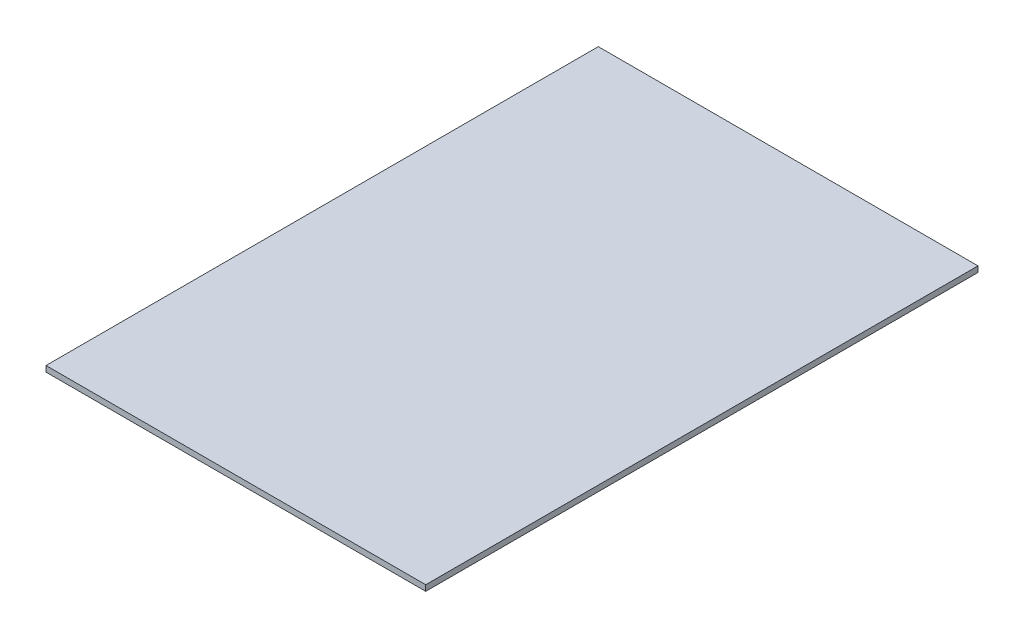
ISO-10303-21;
HEADER;
FILE_DESCRIPTION(('STEP AP214'),'2;1');
FILE_NAME('part.step','',(''),(''),'','','');
FILE_SCHEMA(('AUTOMOTIVE_DESIGN { 1 0 10303 214 1 1 1 1 }'));
ENDSEC;
DATA;
#1=APPLICATION_CONTEXT('core data for automotive mechanical design processes');
#2=APPLICATION_PROTOCOL_DEFINITION('international standard','automotive_design',2000,#1);
#3=PRODUCT_CONTEXT('',#1,'mechanical');
#4=PRODUCT('Part','Part','',(#3));
#5=PRODUCT_RELATED_PRODUCT_CATEGORY('part','',(#4));
#6=PRODUCT_DEFINITION_FORMATION('','',#4);
#7=PRODUCT_DEFINITION_CONTEXT('part definition',#1,'design');
#8=PRODUCT_DEFINITION('design','',#6,#7);
#9=PRODUCT_DEFINITION_SHAPE('','',#8);
#10=(LENGTH_UNIT() NAMED_UNIT(*) SI_UNIT(.MILLI.,.METRE.));
#11=(NAMED_UNIT(*) PLANE_ANGLE_UNIT() SI_UNIT($,.RADIAN.));
#12=(NAMED_UNIT(*) SI_UNIT($,.STERADIAN.) SOLID_ANGLE_UNIT());
#13=UNCERTAINTY_MEASURE_WITH_UNIT(LENGTH_MEASURE(1.E-05),#10,'distance_accuracy_value','');
#14=(GEOMETRIC_REPRESENTATION_CONTEXT(3) GLOBAL_UNCERTAINTY_ASSIGNED_CONTEXT((#13)) GLOBAL_UNIT_ASSIGNED_CONTEXT((#10,
#11,#12)) REPRESENTATION_CONTEXT('',''));
#15=CARTESIAN_POINT('',(0.,0.,0.));
#16=DIRECTION('',(0.,0.,1.));
#17=DIRECTION('',(1.,0.,0.));
#18=AXIS2_PLACEMENT_3D('',#15,#16,#17);
#19=CARTESIAN_POINT('',(419.1,12.7,-609.6));
#20=DIRECTION('',(1.,0.,0.));
#21=DIRECTION('',(0.,0.,-1.));
#22=AXIS2_PLACEMENT_3D('',#19,#20,#21);
#23=PLANE('',#22);
#24=DIRECTION('',(0.,0.,1.));
#25=VECTOR('',#24,1.);
#26=CARTESIAN_POINT('',(419.1,0.,-609.6));
#27=LINE('',#26,#25);
#28=CARTESIAN_POINT('',(419.1,0.,-609.6));
#29=VERTEX_POINT('',#28);
#30=CARTESIAN_POINT('',(419.1,0.,609.6));
#31=VERTEX_POINT('',#30);
#32=EDGE_CURVE('E98',#29,#31,#27,.T.);
#33=ORIENTED_EDGE('',*,*,#32,.F.);
#34=DIRECTION('',(0.,-1.,0.));
#35=VECTOR('',#34,1.);
#36=CARTESIAN_POINT('',(419.1,12.7,-609.6));
#37=LINE('',#36,#35);
#38=CARTESIAN_POINT('',(419.1,12.7,-609.6));
#39=VERTEX_POINT('',#38);
#40=EDGE_CURVE('E11',#39,#29,#37,.T.);
#41=ORIENTED_EDGE('',*,*,#40,.F.);
#42=DIRECTION('',(0.,0.,1.));
#43=VECTOR('',#42,1.);
#44=CARTESIAN_POINT('',(419.1,12.7,-609.6));
#45=LINE('',#44,#43);
#46=CARTESIAN_POINT('',(419.1,12.7,609.6));
#47=VERTEX_POINT('',#46);
#48=EDGE_CURVE('E93',#39,#47,#45,.T.);
#49=ORIENTED_EDGE('',*,*,#48,.T.);
#50=DIRECTION('',(0.,-1.,0.));
#51=VECTOR('',#50,1.);
#52=CARTESIAN_POINT('',(419.1,12.7,609.6));
#53=LINE('',#52,#51);
#54=EDGE_CURVE('E36',#47,#31,#53,.T.);
#55=ORIENTED_EDGE('',*,*,#54,.T.);
#56=EDGE_LOOP('',(#33,#41,#49,#55));
#57=FACE_BOUND('',#56,.T.);
#58=ADVANCED_FACE('F33',(#57),#23,.T.);
#59=CARTESIAN_POINT('',(419.1,12.7,-609.6));
#60=DIRECTION('',(0.,0.,1.));
#61=DIRECTION('',(1.,0.,0.));
#62=AXIS2_PLACEMENT_3D('',#59,#60,#61);
#63=PLANE('',#62);
#64=DIRECTION('',(-1.,0.,0.));
#65=VECTOR('',#64,1.);
#66=CARTESIAN_POINT('',(419.1,0.,-609.6));
#67=LINE('',#66,#65);
#68=CARTESIAN_POINT('',(-419.1,0.,-609.6));
#69=VERTEX_POINT('',#68);
#70=EDGE_CURVE('E66',#29,#69,#67,.T.);
#71=ORIENTED_EDGE('',*,*,#70,.T.);
#72=DIRECTION('',(0.,-1.,0.));
#73=VECTOR('',#72,1.);
#74=CARTESIAN_POINT('',(-419.1,12.7,-609.6));
#75=LINE('',#74,#73);
#76=CARTESIAN_POINT('',(-419.1,12.7,-609.6));
#77=VERTEX_POINT('',#76);
#78=EDGE_CURVE('E42',#77,#69,#75,.T.);
#79=ORIENTED_EDGE('',*,*,#78,.F.);
#80=DIRECTION('',(-1.,0.,0.));
#81=VECTOR('',#80,1.);
#82=CARTESIAN_POINT('',(419.1,12.7,-609.6));
#83=LINE('',#82,#81);
#84=EDGE_CURVE('E83',#39,#77,#83,.T.);
#85=ORIENTED_EDGE('',*,*,#84,.F.);
#86=ORIENTED_EDGE('',*,*,#40,.T.);
#87=EDGE_LOOP('',(#71,#79,#85,#86));
#88=FACE_BOUND('',#87,.T.);
#89=ADVANCED_FACE('F108',(#88),#63,.F.);
#90=CARTESIAN_POINT('',(-419.1,12.7,-609.6));
#91=DIRECTION('',(1.,0.,0.));
#92=DIRECTION('',(0.,0.,-1.));
#93=AXIS2_PLACEMENT_3D('',#90,#91,#92);
#94=PLANE('',#93);
#95=DIRECTION('',(0.,0.,1.));
#96=VECTOR('',#95,1.);
#97=CARTESIAN_POINT('',(-419.1,0.,-609.6));
#98=LINE('',#97,#96);
#99=CARTESIAN_POINT('',(-419.1,0.,609.6));
#100=VERTEX_POINT('',#99);
#101=EDGE_CURVE('E90',#69,#100,#98,.T.);
#102=ORIENTED_EDGE('',*,*,#101,.T.);
#103=DIRECTION('',(0.,-1.,0.));
#104=VECTOR('',#103,1.);
#105=CARTESIAN_POINT('',(-419.1,12.7,609.6));
#106=LINE('',#105,#104);
#107=CARTESIAN_POINT('',(-419.1,12.7,609.6));
#108=VERTEX_POINT('',#107);
#109=EDGE_CURVE('E87',#108,#100,#106,.T.);
#110=ORIENTED_EDGE('',*,*,#109,.F.);
#111=DIRECTION('',(0.,0.,1.));
#112=VECTOR('',#111,1.);
#113=CARTESIAN_POINT('',(-419.1,12.7,-609.6));
#114=LINE('',#113,#112);
#115=EDGE_CURVE('E78',#77,#108,#114,.T.);
#116=ORIENTED_EDGE('',*,*,#115,.F.);
#117=ORIENTED_EDGE('',*,*,#78,.T.);
#118=EDGE_LOOP('',(#102,#110,#116,#117));
#119=FACE_BOUND('',#118,.T.);
#120=ADVANCED_FACE('F88',(#119),#94,.F.);
#121=CARTESIAN_POINT('',(419.1,12.7,609.6));
#122=DIRECTION('',(0.,0.,1.));
#123=DIRECTION('',(1.,0.,0.));
#124=AXIS2_PLACEMENT_3D('',#121,#122,#123);
#125=PLANE('',#124);
#126=DIRECTION('',(-1.,0.,0.));
#127=VECTOR('',#126,1.);
#128=CARTESIAN_POINT('',(419.1,0.,609.6));
#129=LINE('',#128,#127);
#130=EDGE_CURVE('E101',#31,#100,#129,.T.);
#131=ORIENTED_EDGE('',*,*,#130,.F.);
#132=ORIENTED_EDGE('',*,*,#54,.F.);
#133=DIRECTION('',(-1.,0.,0.));
#134=VECTOR('',#133,1.);
#135=CARTESIAN_POINT('',(419.1,12.7,609.6));
#136=LINE('',#135,#134);
#137=EDGE_CURVE('E82',#47,#108,#136,.T.);
#138=ORIENTED_EDGE('',*,*,#137,.T.);
#139=ORIENTED_EDGE('',*,*,#109,.T.);
#140=EDGE_LOOP('',(#131,#132,#138,#139));
#141=FACE_BOUND('',#140,.T.);
#142=ADVANCED_FACE('F92',(#141),#125,.T.);
#143=CARTESIAN_POINT('',(0.,12.7,0.));
#144=DIRECTION('',(0.,-1.,0.));
#145=DIRECTION('',(0.,0.,-1.));
#146=AXIS2_PLACEMENT_3D('',#143,#144,#145);
#147=PLANE('',#146);
#148=ORIENTED_EDGE('',*,*,#48,.F.);
#149=ORIENTED_EDGE('',*,*,#84,.T.);
#150=ORIENTED_EDGE('',*,*,#115,.T.);
#151=ORIENTED_EDGE('',*,*,#137,.F.);
#152=EDGE_LOOP('',(#148,#149,#150,#151));
#153=FACE_BOUND('',#152,.T.);
#154=ADVANCED_FACE('F81',(#153),#147,.F.);
#155=CARTESIAN_POINT('',(0.,0.,0.));
#156=DIRECTION('',(0.,-1.,0.));
#157=DIRECTION('',(0.,0.,-1.));
#158=AXIS2_PLACEMENT_3D('',#155,#156,#157);
#159=PLANE('',#158);
#160=ORIENTED_EDGE('',*,*,#32,.T.);
#161=ORIENTED_EDGE('',*,*,#130,.T.);
#162=ORIENTED_EDGE('',*,*,#101,.F.);
#163=ORIENTED_EDGE('',*,*,#70,.F.);
#164=EDGE_LOOP('',(#160,#161,#162,#163));
#165=FACE_BOUND('',#164,.T.);
#166=ADVANCED_FACE('F106',(#165),#159,.T.);
#167=CLOSED_SHELL('',(#58,#89,#120,#142,#154,#166));
#168=MANIFOLD_SOLID_BREP('B2',#167);
#169=ADVANCED_BREP_SHAPE_REPRESENTATION('',(#18,#168),#14);
#170=SHAPE_DEFINITION_REPRESENTATION(#9,#169);
ENDSEC;
END-ISO-10303-21;
